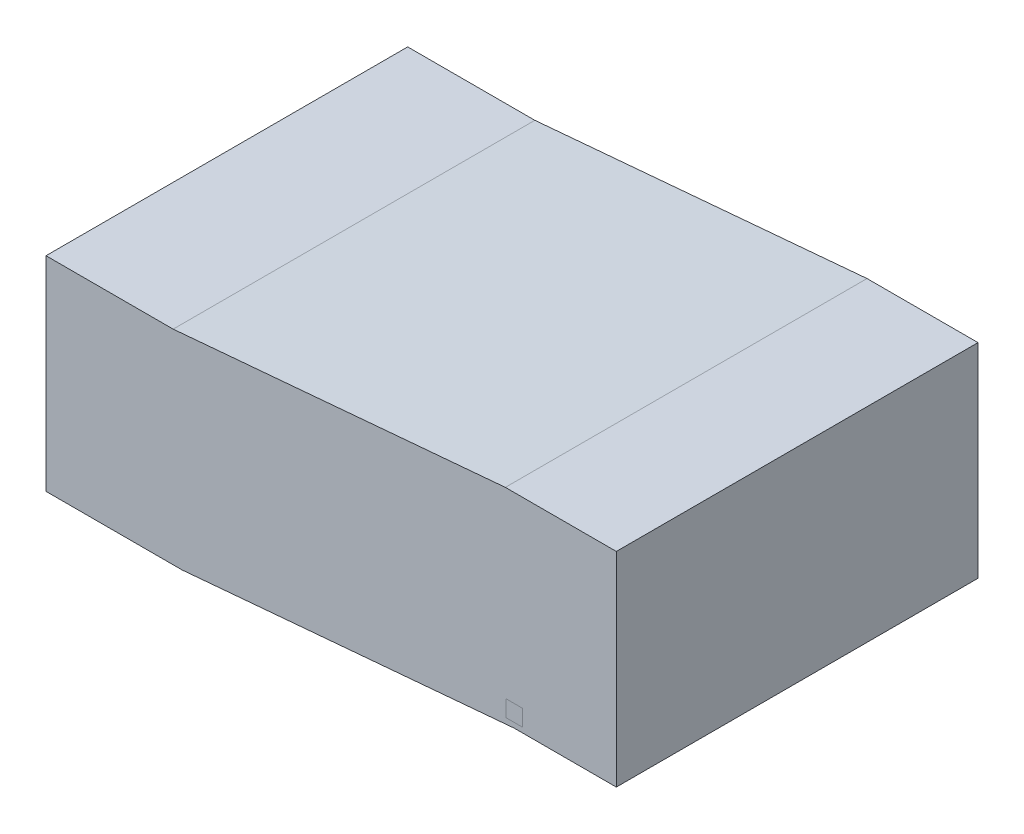
ISO-10303-21;
HEADER;
FILE_DESCRIPTION(('STEP AP214'),'2;1');
FILE_NAME('part.step','',(''),(''),'','','');
FILE_SCHEMA(('AUTOMOTIVE_DESIGN { 1 0 10303 214 1 1 1 1 }'));
ENDSEC;
DATA;
#1=APPLICATION_CONTEXT('core data for automotive mechanical design processes');
#2=APPLICATION_PROTOCOL_DEFINITION('international standard','automotive_design',2000,#1);
#3=PRODUCT_CONTEXT('',#1,'mechanical');
#4=PRODUCT('Part','Part','',(#3));
#5=PRODUCT_RELATED_PRODUCT_CATEGORY('part','',(#4));
#6=PRODUCT_DEFINITION_FORMATION('','',#4);
#7=PRODUCT_DEFINITION_CONTEXT('part definition',#1,'design');
#8=PRODUCT_DEFINITION('design','',#6,#7);
#9=PRODUCT_DEFINITION_SHAPE('','',#8);
#10=(LENGTH_UNIT() NAMED_UNIT(*) SI_UNIT(.MILLI.,.METRE.));
#11=(NAMED_UNIT(*) PLANE_ANGLE_UNIT() SI_UNIT($,.RADIAN.));
#12=(NAMED_UNIT(*) SI_UNIT($,.STERADIAN.) SOLID_ANGLE_UNIT());
#13=UNCERTAINTY_MEASURE_WITH_UNIT(LENGTH_MEASURE(1.E-05),#10,'distance_accuracy_value','');
#14=(GEOMETRIC_REPRESENTATION_CONTEXT(3) GLOBAL_UNCERTAINTY_ASSIGNED_CONTEXT((#13)) GLOBAL_UNIT_ASSIGNED_CONTEXT((#10,
#11,#12)) REPRESENTATION_CONTEXT('',''));
#15=CARTESIAN_POINT('',(0.,0.,0.));
#16=DIRECTION('',(0.,0.,1.));
#17=DIRECTION('',(1.,0.,0.));
#18=AXIS2_PLACEMENT_3D('',#15,#16,#17);
#19=CARTESIAN_POINT('',(0.,0.,0.));
#20=DIRECTION('',(0.,0.,1.));
#21=DIRECTION('',(1.,0.,0.));
#22=AXIS2_PLACEMENT_3D('',#19,#20,#21);
#23=PLANE('',#22);
#24=DIRECTION('',(0.,-1.,0.));
#25=VECTOR('',#24,1.);
#26=CARTESIAN_POINT('',(0.,3000.,0.));
#27=LINE('',#26,#25);
#28=CARTESIAN_POINT('',(0.,3000.,0.));
#29=VERTEX_POINT('',#28);
#30=CARTESIAN_POINT('',(0.,0.,0.));
#31=VERTEX_POINT('',#30);
#32=EDGE_CURVE('E158',#29,#31,#27,.T.);
#33=ORIENTED_EDGE('',*,*,#32,.F.);
#34=DIRECTION('',(-1.,0.,0.));
#35=VECTOR('',#34,1.);
#36=CARTESIAN_POINT('',(0.,3000.,0.));
#37=LINE('',#36,#35);
#38=CARTESIAN_POINT('',(1869.01717127445,3000.,0.));
#39=VERTEX_POINT('',#38);
#40=EDGE_CURVE('E153',#39,#29,#37,.T.);
#41=ORIENTED_EDGE('',*,*,#40,.F.);
#42=DIRECTION('',(-0.996194698091745,-0.0871557427476659,0.));
#43=VECTOR('',#42,1.);
#44=CARTESIAN_POINT('',(1869.01717127445,3000.,0.));
#45=LINE('',#44,#43);
#46=CARTESIAN_POINT('',(6751.51717127445,3427.16339966536,0.));
#47=VERTEX_POINT('',#46);
#48=EDGE_CURVE('E375',#47,#39,#45,.T.);
#49=ORIENTED_EDGE('',*,*,#48,.F.);
#50=DIRECTION('',(-1.,0.,0.));
#51=VECTOR('',#50,1.);
#52=CARTESIAN_POINT('',(6751.51717127445,3427.16339966536,0.));
#53=LINE('',#52,#51);
#54=CARTESIAN_POINT('',(8382.5,3427.16339966536,0.));
#55=VERTEX_POINT('',#54);
#56=EDGE_CURVE('E370',#55,#47,#53,.T.);
#57=ORIENTED_EDGE('',*,*,#56,.F.);
#58=DIRECTION('',(0.,1.,0.));
#59=VECTOR('',#58,1.);
#60=CARTESIAN_POINT('',(8382.5,3427.16339966536,0.));
#61=LINE('',#60,#59);
#62=CARTESIAN_POINT('',(8382.5,427.163399665362,0.));
#63=VERTEX_POINT('',#62);
#64=EDGE_CURVE('E368',#63,#55,#61,.T.);
#65=ORIENTED_EDGE('',*,*,#64,.F.);
#66=DIRECTION('',(1.,0.,0.));
#67=VECTOR('',#66,1.);
#68=CARTESIAN_POINT('',(6882.5,427.163399665362,0.));
#69=LINE('',#68,#67);
#70=CARTESIAN_POINT('',(6882.5,427.163399665362,0.));
#71=VERTEX_POINT('',#70);
#72=EDGE_CURVE('E359',#71,#63,#69,.T.);
#73=ORIENTED_EDGE('',*,*,#72,.F.);
#74=DIRECTION('',(0.996194698091745,0.0871557427476658,0.));
#75=VECTOR('',#74,1.);
#76=CARTESIAN_POINT('',(2000.,0.,0.));
#77=LINE('',#76,#75);
#78=CARTESIAN_POINT('',(2000.,0.,0.));
#79=VERTEX_POINT('',#78);
#80=EDGE_CURVE('E355',#79,#71,#77,.T.);
#81=ORIENTED_EDGE('',*,*,#80,.F.);
#82=DIRECTION('',(1.,0.,0.));
#83=VECTOR('',#82,1.);
#84=CARTESIAN_POINT('',(0.,0.,0.));
#85=LINE('',#84,#83);
#86=EDGE_CURVE('E360',#31,#79,#85,.T.);
#87=ORIENTED_EDGE('',*,*,#86,.F.);
#88=EDGE_LOOP('',(#33,#41,#49,#57,#65,#73,#81,#87));
#89=FACE_BOUND('',#88,.T.);
#90=DIRECTION('',(0.,1.,0.));
#91=VECTOR('',#90,1.);
#92=CARTESIAN_POINT('',(6761.85,0.,0.));
#93=LINE('',#92,#91);
#94=CARTESIAN_POINT('',(6761.85,500.,0.));
#95=VERTEX_POINT('',#94);
#96=CARTESIAN_POINT('',(6761.85,741.3,0.));
#97=VERTEX_POINT('',#96);
#98=EDGE_CURVE('E11',#95,#97,#93,.T.);
#99=ORIENTED_EDGE('',*,*,#98,.F.);
#100=DIRECTION('',(-1.,0.,0.));
#101=VECTOR('',#100,1.);
#102=CARTESIAN_POINT('',(0.,500.,0.));
#103=LINE('',#102,#101);
#104=CARTESIAN_POINT('',(7003.15,500.,0.));
#105=VERTEX_POINT('',#104);
#106=EDGE_CURVE('E192',#105,#95,#103,.T.);
#107=ORIENTED_EDGE('',*,*,#106,.F.);
#108=DIRECTION('',(0.,-1.,0.));
#109=VECTOR('',#108,1.);
#110=CARTESIAN_POINT('',(7003.15,2.57772345624655E-11,0.));
#111=LINE('',#110,#109);
#112=CARTESIAN_POINT('',(7003.15,741.3,0.));
#113=VERTEX_POINT('',#112);
#114=EDGE_CURVE('E195',#113,#105,#111,.T.);
#115=ORIENTED_EDGE('',*,*,#114,.F.);
#116=DIRECTION('',(1.,0.,0.));
#117=VECTOR('',#116,1.);
#118=CARTESIAN_POINT('',(0.,741.3,0.));
#119=LINE('',#118,#117);
#120=EDGE_CURVE('E44',#97,#113,#119,.T.);
#121=ORIENTED_EDGE('',*,*,#120,.F.);
#122=EDGE_LOOP('',(#99,#107,#115,#121));
#123=FACE_BOUND('',#122,.T.);
#124=ADVANCED_FACE('F35',(#89,#123),#23,.F.);
#125=CARTESIAN_POINT('',(0.,0.,5316.));
#126=DIRECTION('',(0.,0.,1.));
#127=DIRECTION('',(1.,0.,0.));
#128=AXIS2_PLACEMENT_3D('',#125,#126,#127);
#129=PLANE('',#128);
#130=DIRECTION('',(0.,-1.,0.));
#131=VECTOR('',#130,1.);
#132=CARTESIAN_POINT('',(0.,3000.,5316.));
#133=LINE('',#132,#131);
#134=CARTESIAN_POINT('',(0.,3000.,5316.));
#135=VERTEX_POINT('',#134);
#136=CARTESIAN_POINT('',(0.,0.,5316.));
#137=VERTEX_POINT('',#136);
#138=EDGE_CURVE('E143',#135,#137,#133,.T.);
#139=ORIENTED_EDGE('',*,*,#138,.T.);
#140=DIRECTION('',(1.,0.,0.));
#141=VECTOR('',#140,1.);
#142=CARTESIAN_POINT('',(0.,0.,5316.));
#143=LINE('',#142,#141);
#144=CARTESIAN_POINT('',(2000.,0.,5316.));
#145=VERTEX_POINT('',#144);
#146=EDGE_CURVE('E132',#137,#145,#143,.T.);
#147=ORIENTED_EDGE('',*,*,#146,.T.);
#148=DIRECTION('',(0.996194698091745,0.0871557427476658,0.));
#149=VECTOR('',#148,1.);
#150=CARTESIAN_POINT('',(2000.,0.,5316.));
#151=LINE('',#150,#149);
#152=CARTESIAN_POINT('',(6882.5,427.163399665362,5316.));
#153=VERTEX_POINT('',#152);
#154=EDGE_CURVE('E142',#145,#153,#151,.T.);
#155=ORIENTED_EDGE('',*,*,#154,.T.);
#156=DIRECTION('',(1.,0.,0.));
#157=VECTOR('',#156,1.);
#158=CARTESIAN_POINT('',(6882.5,427.163399665362,5316.));
#159=LINE('',#158,#157);
#160=CARTESIAN_POINT('',(8382.5,427.163399665362,5316.));
#161=VERTEX_POINT('',#160);
#162=EDGE_CURVE('E364',#153,#161,#159,.T.);
#163=ORIENTED_EDGE('',*,*,#162,.T.);
#164=DIRECTION('',(0.,1.,0.));
#165=VECTOR('',#164,1.);
#166=CARTESIAN_POINT('',(8382.5,3427.16339966536,5316.));
#167=LINE('',#166,#165);
#168=CARTESIAN_POINT('',(8382.5,3427.16339966536,5316.));
#169=VERTEX_POINT('',#168);
#170=EDGE_CURVE('E391',#161,#169,#167,.T.);
#171=ORIENTED_EDGE('',*,*,#170,.T.);
#172=DIRECTION('',(-1.,0.,0.));
#173=VECTOR('',#172,1.);
#174=CARTESIAN_POINT('',(6751.51717127445,3427.16339966536,5316.));
#175=LINE('',#174,#173);
#176=CARTESIAN_POINT('',(6751.51717127445,3427.16339966536,5316.));
#177=VERTEX_POINT('',#176);
#178=EDGE_CURVE('E393',#169,#177,#175,.T.);
#179=ORIENTED_EDGE('',*,*,#178,.T.);
#180=DIRECTION('',(-0.996194698091745,-0.0871557427476659,0.));
#181=VECTOR('',#180,1.);
#182=CARTESIAN_POINT('',(1869.01717127445,3000.,5316.));
#183=LINE('',#182,#181);
#184=CARTESIAN_POINT('',(1869.01717127445,3000.,5316.));
#185=VERTEX_POINT('',#184);
#186=EDGE_CURVE('E395',#177,#185,#183,.T.);
#187=ORIENTED_EDGE('',*,*,#186,.T.);
#188=DIRECTION('',(-1.,0.,0.));
#189=VECTOR('',#188,1.);
#190=CARTESIAN_POINT('',(0.,3000.,5316.));
#191=LINE('',#190,#189);
#192=EDGE_CURVE('E149',#185,#135,#191,.T.);
#193=ORIENTED_EDGE('',*,*,#192,.T.);
#194=EDGE_LOOP('',(#139,#147,#155,#163,#171,#179,#187,#193));
#195=FACE_BOUND('',#194,.T.);
#196=DIRECTION('',(-1.,0.,0.));
#197=VECTOR('',#196,1.);
#198=CARTESIAN_POINT('',(0.,500.,5316.));
#199=LINE('',#198,#197);
#200=CARTESIAN_POINT('',(7003.15,500.,5316.));
#201=VERTEX_POINT('',#200);
#202=CARTESIAN_POINT('',(6761.85,500.,5316.));
#203=VERTEX_POINT('',#202);
#204=EDGE_CURVE('E185',#201,#203,#199,.T.);
#205=ORIENTED_EDGE('',*,*,#204,.T.);
#206=DIRECTION('',(0.,1.,0.));
#207=VECTOR('',#206,1.);
#208=CARTESIAN_POINT('',(6761.85,0.,5316.));
#209=LINE('',#208,#207);
#210=CARTESIAN_POINT('',(6761.85,741.3,5316.));
#211=VERTEX_POINT('',#210);
#212=EDGE_CURVE('E189',#203,#211,#209,.T.);
#213=ORIENTED_EDGE('',*,*,#212,.T.);
#214=DIRECTION('',(1.,0.,0.));
#215=VECTOR('',#214,1.);
#216=CARTESIAN_POINT('',(0.,741.3,5316.));
#217=LINE('',#216,#215);
#218=CARTESIAN_POINT('',(7003.15,741.3,5316.));
#219=VERTEX_POINT('',#218);
#220=EDGE_CURVE('E177',#211,#219,#217,.T.);
#221=ORIENTED_EDGE('',*,*,#220,.T.);
#222=DIRECTION('',(0.,-1.,0.));
#223=VECTOR('',#222,1.);
#224=CARTESIAN_POINT('',(7003.15,2.57772345624655E-11,5316.));
#225=LINE('',#224,#223);
#226=EDGE_CURVE('E181',#219,#201,#225,.T.);
#227=ORIENTED_EDGE('',*,*,#226,.T.);
#228=EDGE_LOOP('',(#205,#213,#221,#227));
#229=FACE_BOUND('',#228,.T.);
#230=ADVANCED_FACE('F146',(#195,#229),#129,.T.);
#231=CARTESIAN_POINT('',(0.,3000.,5316.));
#232=DIRECTION('',(1.,0.,0.));
#233=DIRECTION('',(0.,0.,-1.));
#234=AXIS2_PLACEMENT_3D('',#231,#232,#233);
#235=PLANE('',#234);
#236=ORIENTED_EDGE('',*,*,#32,.T.);
#237=DIRECTION('',(0.,0.,-1.));
#238=VECTOR('',#237,1.);
#239=CARTESIAN_POINT('',(0.,0.,5316.));
#240=LINE('',#239,#238);
#241=EDGE_CURVE('E136',#137,#31,#240,.T.);
#242=ORIENTED_EDGE('',*,*,#241,.F.);
#243=ORIENTED_EDGE('',*,*,#138,.F.);
#244=DIRECTION('',(0.,0.,-1.));
#245=VECTOR('',#244,1.);
#246=CARTESIAN_POINT('',(0.,3000.,5316.));
#247=LINE('',#246,#245);
#248=EDGE_CURVE('E378',#135,#29,#247,.T.);
#249=ORIENTED_EDGE('',*,*,#248,.T.);
#250=EDGE_LOOP('',(#236,#242,#243,#249));
#251=FACE_BOUND('',#250,.T.);
#252=DIRECTION('',(0.,-1.,0.));
#253=VECTOR('',#252,1.);
#254=CARTESIAN_POINT('',(0.,3000.,2537.35));
#255=LINE('',#254,#253);
#256=CARTESIAN_POINT('',(0.,741.299999999999,2537.35));
#257=VERTEX_POINT('',#256);
#258=CARTESIAN_POINT('',(0.,499.999999999999,2537.35));
#259=VERTEX_POINT('',#258);
#260=EDGE_CURVE('E174',#257,#259,#255,.T.);
#261=ORIENTED_EDGE('',*,*,#260,.F.);
#262=DIRECTION('',(0.,0.,-1.));
#263=VECTOR('',#262,1.);
#264=CARTESIAN_POINT('',(0.,741.299999999999,5316.));
#265=LINE('',#264,#263);
#266=CARTESIAN_POINT('',(0.,741.299999999999,2778.65));
#267=VERTEX_POINT('',#266);
#268=EDGE_CURVE('E159',#267,#257,#265,.T.);
#269=ORIENTED_EDGE('',*,*,#268,.F.);
#270=DIRECTION('',(0.,1.,0.));
#271=VECTOR('',#270,1.);
#272=CARTESIAN_POINT('',(0.,3000.,2778.65));
#273=LINE('',#272,#271);
#274=CARTESIAN_POINT('',(0.,500.,2778.65));
#275=VERTEX_POINT('',#274);
#276=EDGE_CURVE('E163',#275,#267,#273,.T.);
#277=ORIENTED_EDGE('',*,*,#276,.F.);
#278=DIRECTION('',(0.,0.,1.));
#279=VECTOR('',#278,1.);
#280=CARTESIAN_POINT('',(0.,500.,5316.));
#281=LINE('',#280,#279);
#282=EDGE_CURVE('E171',#259,#275,#281,.T.);
#283=ORIENTED_EDGE('',*,*,#282,.F.);
#284=EDGE_LOOP('',(#261,#269,#277,#283));
#285=FACE_BOUND('',#284,.T.);
#286=ADVANCED_FACE('F155',(#251,#285),#235,.F.);
#287=ORIENTED_EDGE('',*,*,#268,.T.);
#288=ORIENTED_EDGE('',*,*,#260,.T.);
#289=ORIENTED_EDGE('',*,*,#282,.T.);
#290=ORIENTED_EDGE('',*,*,#276,.T.);
#291=EDGE_LOOP('',(#287,#288,#289,#290));
#292=FACE_BOUND('',#291,.T.);
#293=ADVANCED_FACE('F37',(#292),#235,.F.);
#294=CARTESIAN_POINT('',(0.,0.,5316.));
#295=DIRECTION('',(0.,1.,0.));
#296=DIRECTION('',(-1.,0.,0.));
#297=AXIS2_PLACEMENT_3D('',#294,#295,#296);
#298=PLANE('',#297);
#299=ORIENTED_EDGE('',*,*,#86,.T.);
#300=DIRECTION('',(0.,0.,-1.));
#301=VECTOR('',#300,1.);
#302=CARTESIAN_POINT('',(2000.,0.,5316.));
#303=LINE('',#302,#301);
#304=EDGE_CURVE('E139',#145,#79,#303,.T.);
#305=ORIENTED_EDGE('',*,*,#304,.F.);
#306=ORIENTED_EDGE('',*,*,#146,.F.);
#307=ORIENTED_EDGE('',*,*,#241,.T.);
#308=EDGE_LOOP('',(#299,#305,#306,#307));
#309=FACE_BOUND('',#308,.T.);
#310=ADVANCED_FACE('F134',(#309),#298,.F.);
#311=CARTESIAN_POINT('',(2000.,0.,5316.));
#312=DIRECTION('',(-0.0871557427476658,0.996194698091745,0.));
#313=DIRECTION('',(-0.996194698091745,-0.0871557427476658,0.));
#314=AXIS2_PLACEMENT_3D('',#311,#312,#313);
#315=PLANE('',#314);
#316=ORIENTED_EDGE('',*,*,#80,.T.);
#317=DIRECTION('',(0.,0.,-1.));
#318=VECTOR('',#317,1.);
#319=CARTESIAN_POINT('',(6882.5,427.163399665362,5316.));
#320=LINE('',#319,#318);
#321=EDGE_CURVE('E165',#153,#71,#320,.T.);
#322=ORIENTED_EDGE('',*,*,#321,.F.);
#323=ORIENTED_EDGE('',*,*,#154,.F.);
#324=ORIENTED_EDGE('',*,*,#304,.T.);
#325=EDGE_LOOP('',(#316,#322,#323,#324));
#326=FACE_BOUND('',#325,.T.);
#327=ADVANCED_FACE('F263',(#326),#315,.F.);
#328=CARTESIAN_POINT('',(6882.5,427.163399665362,5316.));
#329=DIRECTION('',(0.,1.,0.));
#330=DIRECTION('',(0.,0.,1.));
#331=AXIS2_PLACEMENT_3D('',#328,#329,#330);
#332=PLANE('',#331);
#333=ORIENTED_EDGE('',*,*,#72,.T.);
#334=DIRECTION('',(0.,0.,-1.));
#335=VECTOR('',#334,1.);
#336=CARTESIAN_POINT('',(8382.5,427.163399665362,5316.));
#337=LINE('',#336,#335);
#338=EDGE_CURVE('E365',#161,#63,#337,.T.);
#339=ORIENTED_EDGE('',*,*,#338,.F.);
#340=ORIENTED_EDGE('',*,*,#162,.F.);
#341=ORIENTED_EDGE('',*,*,#321,.T.);
#342=EDGE_LOOP('',(#333,#339,#340,#341));
#343=FACE_BOUND('',#342,.T.);
#344=ADVANCED_FACE('F259',(#343),#332,.F.);
#345=CARTESIAN_POINT('',(8382.5,3427.16339966536,5316.));
#346=DIRECTION('',(-1.,0.,0.));
#347=DIRECTION('',(0.,0.,1.));
#348=AXIS2_PLACEMENT_3D('',#345,#346,#347);
#349=PLANE('',#348);
#350=ORIENTED_EDGE('',*,*,#64,.T.);
#351=DIRECTION('',(0.,0.,-1.));
#352=VECTOR('',#351,1.);
#353=CARTESIAN_POINT('',(8382.5,3427.16339966536,5316.));
#354=LINE('',#353,#352);
#355=EDGE_CURVE('E386',#169,#55,#354,.T.);
#356=ORIENTED_EDGE('',*,*,#355,.F.);
#357=ORIENTED_EDGE('',*,*,#170,.F.);
#358=ORIENTED_EDGE('',*,*,#338,.T.);
#359=EDGE_LOOP('',(#350,#356,#357,#358));
#360=FACE_BOUND('',#359,.T.);
#361=ADVANCED_FACE('F255',(#360),#349,.F.);
#362=CARTESIAN_POINT('',(6751.51717127445,3427.16339966536,5316.));
#363=DIRECTION('',(0.,-1.,0.));
#364=DIRECTION('',(0.,0.,-1.));
#365=AXIS2_PLACEMENT_3D('',#362,#363,#364);
#366=PLANE('',#365);
#367=ORIENTED_EDGE('',*,*,#56,.T.);
#368=DIRECTION('',(0.,0.,-1.));
#369=VECTOR('',#368,1.);
#370=CARTESIAN_POINT('',(6751.51717127445,3427.16339966536,5316.));
#371=LINE('',#370,#369);
#372=EDGE_CURVE('E383',#177,#47,#371,.T.);
#373=ORIENTED_EDGE('',*,*,#372,.F.);
#374=ORIENTED_EDGE('',*,*,#178,.F.);
#375=ORIENTED_EDGE('',*,*,#355,.T.);
#376=EDGE_LOOP('',(#367,#373,#374,#375));
#377=FACE_BOUND('',#376,.T.);
#378=ADVANCED_FACE('F249',(#377),#366,.F.);
#379=CARTESIAN_POINT('',(1869.01717127445,3000.,5316.));
#380=DIRECTION('',(0.0871557427476659,-0.996194698091745,0.));
#381=DIRECTION('',(0.996194698091745,0.0871557427476659,0.));
#382=AXIS2_PLACEMENT_3D('',#379,#380,#381);
#383=PLANE('',#382);
#384=ORIENTED_EDGE('',*,*,#48,.T.);
#385=DIRECTION('',(0.,0.,-1.));
#386=VECTOR('',#385,1.);
#387=CARTESIAN_POINT('',(1869.01717127445,3000.,5316.));
#388=LINE('',#387,#386);
#389=EDGE_CURVE('E380',#185,#39,#388,.T.);
#390=ORIENTED_EDGE('',*,*,#389,.F.);
#391=ORIENTED_EDGE('',*,*,#186,.F.);
#392=ORIENTED_EDGE('',*,*,#372,.T.);
#393=EDGE_LOOP('',(#384,#390,#391,#392));
#394=FACE_BOUND('',#393,.T.);
#395=ADVANCED_FACE('F243',(#394),#383,.F.);
#396=CARTESIAN_POINT('',(0.,3000.,5316.));
#397=DIRECTION('',(0.,-1.,0.));
#398=DIRECTION('',(0.,0.,-1.));
#399=AXIS2_PLACEMENT_3D('',#396,#397,#398);
#400=PLANE('',#399);
#401=ORIENTED_EDGE('',*,*,#40,.T.);
#402=ORIENTED_EDGE('',*,*,#248,.F.);
#403=ORIENTED_EDGE('',*,*,#192,.F.);
#404=ORIENTED_EDGE('',*,*,#389,.T.);
#405=EDGE_LOOP('',(#401,#402,#403,#404));
#406=FACE_BOUND('',#405,.T.);
#407=ADVANCED_FACE('F238',(#406),#400,.F.);
#408=ORIENTED_EDGE('',*,*,#212,.F.);
#409=ORIENTED_EDGE('',*,*,#204,.F.);
#410=ORIENTED_EDGE('',*,*,#226,.F.);
#411=ORIENTED_EDGE('',*,*,#220,.F.);
#412=EDGE_LOOP('',(#408,#409,#410,#411));
#413=FACE_BOUND('',#412,.T.);
#414=ADVANCED_FACE('F232',(#413),#129,.T.);
#415=ORIENTED_EDGE('',*,*,#106,.T.);
#416=ORIENTED_EDGE('',*,*,#98,.T.);
#417=ORIENTED_EDGE('',*,*,#120,.T.);
#418=ORIENTED_EDGE('',*,*,#114,.T.);
#419=EDGE_LOOP('',(#415,#416,#417,#418));
#420=FACE_BOUND('',#419,.T.);
#421=ADVANCED_FACE('F223',(#420),#23,.F.);
#422=CLOSED_SHELL('',(#124,#230,#286,#293,#310,#327,#344,#361,#378,#395,#407,#414,#421));
#423=MANIFOLD_SOLID_BREP('B2',#422);
#424=ADVANCED_BREP_SHAPE_REPRESENTATION('',(#18,#423),#14);
#425=SHAPE_DEFINITION_REPRESENTATION(#9,#424);
ENDSEC;
END-ISO-10303-21;
